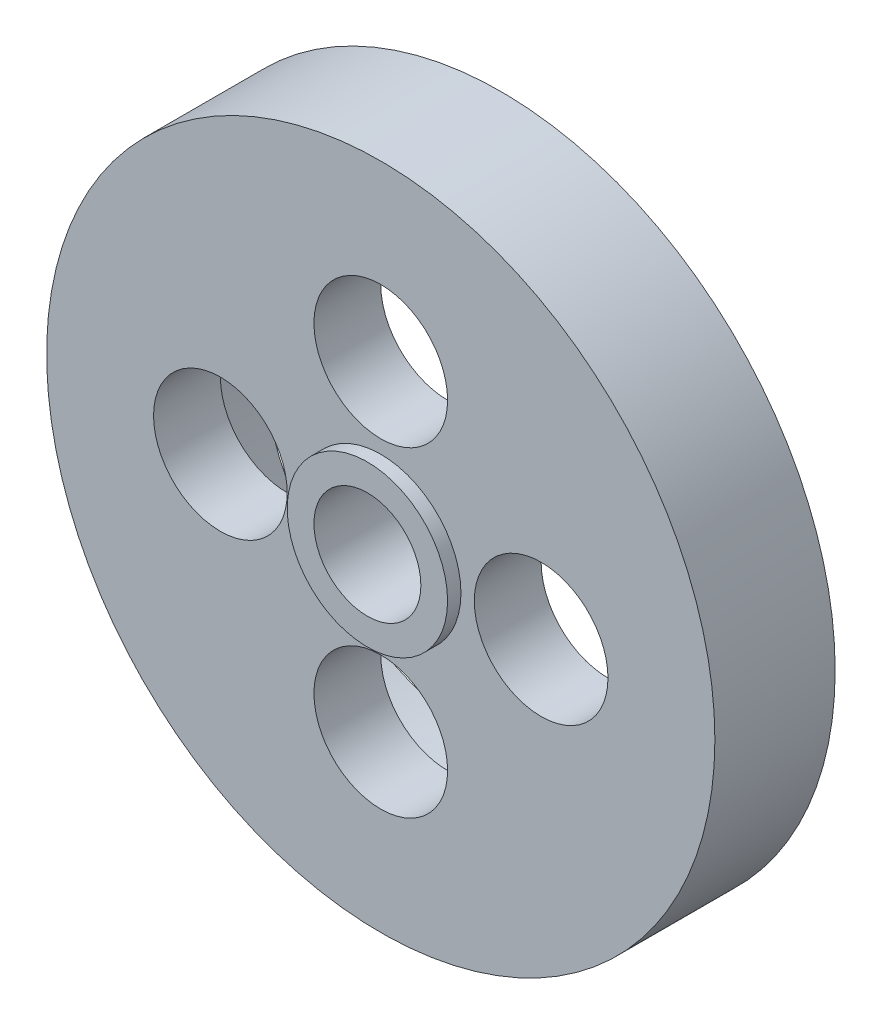
ISO-10303-21;
HEADER;
FILE_DESCRIPTION(('STEP AP214'),'2;1');
FILE_NAME('part.step','',(''),(''),'','','');
FILE_SCHEMA(('AUTOMOTIVE_DESIGN { 1 0 10303 214 1 1 1 1 }'));
ENDSEC;
DATA;
#1=APPLICATION_CONTEXT('core data for automotive mechanical design processes');
#2=APPLICATION_PROTOCOL_DEFINITION('international standard','automotive_design',2000,#1);
#3=PRODUCT_CONTEXT('',#1,'mechanical');
#4=PRODUCT('Part','Part','',(#3));
#5=PRODUCT_RELATED_PRODUCT_CATEGORY('part','',(#4));
#6=PRODUCT_DEFINITION_FORMATION('','',#4);
#7=PRODUCT_DEFINITION_CONTEXT('part definition',#1,'design');
#8=PRODUCT_DEFINITION('design','',#6,#7);
#9=PRODUCT_DEFINITION_SHAPE('','',#8);
#10=(LENGTH_UNIT() NAMED_UNIT(*) SI_UNIT(.MILLI.,.METRE.));
#11=(NAMED_UNIT(*) PLANE_ANGLE_UNIT() SI_UNIT($,.RADIAN.));
#12=(NAMED_UNIT(*) SI_UNIT($,.STERADIAN.) SOLID_ANGLE_UNIT());
#13=UNCERTAINTY_MEASURE_WITH_UNIT(LENGTH_MEASURE(1.E-05),#10,'distance_accuracy_value','');
#14=(GEOMETRIC_REPRESENTATION_CONTEXT(3) GLOBAL_UNCERTAINTY_ASSIGNED_CONTEXT((#13)) GLOBAL_UNIT_ASSIGNED_CONTEXT((#10,
#11,#12)) REPRESENTATION_CONTEXT('',''));
#15=CARTESIAN_POINT('',(0.,0.,0.));
#16=DIRECTION('',(0.,0.,1.));
#17=DIRECTION('',(1.,0.,0.));
#18=AXIS2_PLACEMENT_3D('',#15,#16,#17);
#19=CARTESIAN_POINT('',(0.,0.,9.));
#20=DIRECTION('',(0.,0.,1.));
#21=DIRECTION('',(1.,0.,0.));
#22=AXIS2_PLACEMENT_3D('',#19,#20,#21);
#23=PLANE('',#22);
#24=CARTESIAN_POINT('',(-11.9999999999997,-3.41060513164848E-13,9.));
#25=DIRECTION('',(0.,0.,1.));
#26=DIRECTION('',(1.,0.,0.));
#27=AXIS2_PLACEMENT_3D('',#24,#25,#26);
#28=CIRCLE('',#27,5.00000000000055);
#29=CARTESIAN_POINT('',(-6.99999999999912,-3.41060513164848E-13,9.));
#30=VERTEX_POINT('',#29);
#31=EDGE_CURVE('E58',#30,#30,#28,.T.);
#32=ORIENTED_EDGE('',*,*,#31,.F.);
#33=EDGE_LOOP('',(#32));
#34=FACE_BOUND('',#33,.T.);
#35=CARTESIAN_POINT('',(12.,0.,9.));
#36=DIRECTION('',(0.,0.,1.));
#37=DIRECTION('',(1.,0.,0.));
#38=AXIS2_PLACEMENT_3D('',#35,#36,#37);
#39=CIRCLE('',#38,5.);
#40=CARTESIAN_POINT('',(17.,0.,9.));
#41=VERTEX_POINT('',#40);
#42=EDGE_CURVE('E52',#41,#41,#39,.T.);
#43=ORIENTED_EDGE('',*,*,#42,.F.);
#44=EDGE_LOOP('',(#43));
#45=FACE_BOUND('',#44,.T.);
#46=CARTESIAN_POINT('',(0.,12.,9.));
#47=DIRECTION('',(0.,0.,1.));
#48=DIRECTION('',(1.,0.,0.));
#49=AXIS2_PLACEMENT_3D('',#46,#47,#48);
#50=CIRCLE('',#49,5.);
#51=CARTESIAN_POINT('',(5.,12.,9.));
#52=VERTEX_POINT('',#51);
#53=EDGE_CURVE('E48',#52,#52,#50,.T.);
#54=ORIENTED_EDGE('',*,*,#53,.F.);
#55=EDGE_LOOP('',(#54));
#56=FACE_BOUND('',#55,.T.);
#57=CARTESIAN_POINT('',(0.,0.,9.));
#58=DIRECTION('',(0.,0.,1.));
#59=DIRECTION('',(1.,0.,0.));
#60=AXIS2_PLACEMENT_3D('',#57,#58,#59);
#61=CIRCLE('',#60,25.);
#62=CARTESIAN_POINT('',(25.,0.,9.));
#63=VERTEX_POINT('',#62);
#64=EDGE_CURVE('E10',#63,#63,#61,.T.);
#65=ORIENTED_EDGE('',*,*,#64,.T.);
#66=EDGE_LOOP('',(#65));
#67=FACE_BOUND('',#66,.T.);
#68=CARTESIAN_POINT('',(0.,-12.,9.));
#69=DIRECTION('',(0.,0.,1.));
#70=DIRECTION('',(1.,0.,0.));
#71=AXIS2_PLACEMENT_3D('',#68,#69,#70);
#72=CIRCLE('',#71,5.00000000000008);
#73=CARTESIAN_POINT('',(5.00000000000008,-12.,9.));
#74=VERTEX_POINT('',#73);
#75=EDGE_CURVE('E55',#74,#74,#72,.T.);
#76=ORIENTED_EDGE('',*,*,#75,.F.);
#77=EDGE_LOOP('',(#76));
#78=FACE_BOUND('',#77,.T.);
#79=CARTESIAN_POINT('',(0.,0.,9.));
#80=DIRECTION('',(0.,0.,1.));
#81=DIRECTION('',(1.,0.,0.));
#82=AXIS2_PLACEMENT_3D('',#79,#80,#81);
#83=CIRCLE('',#82,6.);
#84=CARTESIAN_POINT('',(6.,0.,9.));
#85=VERTEX_POINT('',#84);
#86=EDGE_CURVE('E80',#85,#85,#83,.T.);
#87=ORIENTED_EDGE('',*,*,#86,.F.);
#88=EDGE_LOOP('',(#87));
#89=FACE_BOUND('',#88,.T.);
#90=ADVANCED_FACE('F35',(#34,#45,#56,#67,#78,#89),#23,.T.);
#91=CARTESIAN_POINT('',(0.,12.,9.));
#92=DIRECTION('',(0.,0.,-1.));
#93=DIRECTION('',(-1.,0.,0.));
#94=AXIS2_PLACEMENT_3D('',#91,#92,#93);
#95=CYLINDRICAL_SURFACE('',#94,5.);
#96=ORIENTED_EDGE('',*,*,#53,.T.);
#97=EDGE_LOOP('',(#96));
#98=FACE_BOUND('',#97,.T.);
#99=CARTESIAN_POINT('',(0.,12.,4.));
#100=DIRECTION('',(0.,0.,-1.));
#101=DIRECTION('',(-1.,0.,0.));
#102=AXIS2_PLACEMENT_3D('',#99,#100,#101);
#103=CIRCLE('',#102,5.);
#104=CARTESIAN_POINT('',(-5.,12.,4.));
#105=VERTEX_POINT('',#104);
#106=EDGE_CURVE('E61',#105,#105,#103,.T.);
#107=ORIENTED_EDGE('',*,*,#106,.T.);
#108=EDGE_LOOP('',(#107));
#109=FACE_BOUND('',#108,.T.);
#110=ADVANCED_FACE('F107',(#98,#109),#95,.F.);
#111=CARTESIAN_POINT('',(0.,0.,9.));
#112=DIRECTION('',(0.,0.,-1.));
#113=DIRECTION('',(-1.,0.,0.));
#114=AXIS2_PLACEMENT_3D('',#111,#112,#113);
#115=CYLINDRICAL_SURFACE('',#114,4.);
#116=CARTESIAN_POINT('',(0.,0.,4.));
#117=DIRECTION('',(0.,0.,-1.));
#118=DIRECTION('',(-1.,0.,0.));
#119=AXIS2_PLACEMENT_3D('',#116,#117,#118);
#120=CIRCLE('',#119,4.);
#121=CARTESIAN_POINT('',(-4.,0.,4.));
#122=VERTEX_POINT('',#121);
#123=EDGE_CURVE('E64',#122,#122,#120,.T.);
#124=ORIENTED_EDGE('',*,*,#123,.T.);
#125=EDGE_LOOP('',(#124));
#126=FACE_BOUND('',#125,.T.);
#127=CARTESIAN_POINT('',(0.,0.,10.));
#128=DIRECTION('',(0.,0.,1.));
#129=DIRECTION('',(1.,0.,0.));
#130=AXIS2_PLACEMENT_3D('',#127,#128,#129);
#131=CIRCLE('',#130,4.);
#132=CARTESIAN_POINT('',(4.,0.,10.));
#133=VERTEX_POINT('',#132);
#134=EDGE_CURVE('E83',#133,#133,#131,.T.);
#135=ORIENTED_EDGE('',*,*,#134,.T.);
#136=EDGE_LOOP('',(#135));
#137=FACE_BOUND('',#136,.T.);
#138=ADVANCED_FACE('F89',(#126,#137),#115,.F.);
#139=CARTESIAN_POINT('',(12.,0.,9.));
#140=DIRECTION('',(0.,0.,-1.));
#141=DIRECTION('',(-1.,0.,0.));
#142=AXIS2_PLACEMENT_3D('',#139,#140,#141);
#143=CYLINDRICAL_SURFACE('',#142,5.);
#144=ORIENTED_EDGE('',*,*,#42,.T.);
#145=EDGE_LOOP('',(#144));
#146=FACE_BOUND('',#145,.T.);
#147=CARTESIAN_POINT('',(12.,0.,4.));
#148=DIRECTION('',(0.,0.,-1.));
#149=DIRECTION('',(-1.,0.,0.));
#150=AXIS2_PLACEMENT_3D('',#147,#148,#149);
#151=CIRCLE('',#150,5.);
#152=CARTESIAN_POINT('',(7.,0.,4.));
#153=VERTEX_POINT('',#152);
#154=EDGE_CURVE('E67',#153,#153,#151,.T.);
#155=ORIENTED_EDGE('',*,*,#154,.T.);
#156=EDGE_LOOP('',(#155));
#157=FACE_BOUND('',#156,.T.);
#158=ADVANCED_FACE('F144',(#146,#157),#143,.F.);
#159=CARTESIAN_POINT('',(0.,-12.,9.));
#160=DIRECTION('',(0.,0.,-1.));
#161=DIRECTION('',(-1.,0.,0.));
#162=AXIS2_PLACEMENT_3D('',#159,#160,#161);
#163=CYLINDRICAL_SURFACE('',#162,5.00000000000008);
#164=ORIENTED_EDGE('',*,*,#75,.T.);
#165=EDGE_LOOP('',(#164));
#166=FACE_BOUND('',#165,.T.);
#167=CARTESIAN_POINT('',(0.,-12.,4.));
#168=DIRECTION('',(0.,0.,-1.));
#169=DIRECTION('',(-1.,0.,0.));
#170=AXIS2_PLACEMENT_3D('',#167,#168,#169);
#171=CIRCLE('',#170,5.00000000000008);
#172=CARTESIAN_POINT('',(-5.00000000000008,-12.,4.));
#173=VERTEX_POINT('',#172);
#174=EDGE_CURVE('E70',#173,#173,#171,.T.);
#175=ORIENTED_EDGE('',*,*,#174,.T.);
#176=EDGE_LOOP('',(#175));
#177=FACE_BOUND('',#176,.T.);
#178=ADVANCED_FACE('F127',(#166,#177),#163,.F.);
#179=CARTESIAN_POINT('',(-11.9999999999997,-3.41060513164848E-13,9.));
#180=DIRECTION('',(0.,0.,-1.));
#181=DIRECTION('',(-1.,0.,0.));
#182=AXIS2_PLACEMENT_3D('',#179,#180,#181);
#183=CYLINDRICAL_SURFACE('',#182,5.00000000000055);
#184=ORIENTED_EDGE('',*,*,#31,.T.);
#185=EDGE_LOOP('',(#184));
#186=FACE_BOUND('',#185,.T.);
#187=CARTESIAN_POINT('',(-11.9999999999997,-3.41060513164848E-13,4.));
#188=DIRECTION('',(0.,0.,-1.));
#189=DIRECTION('',(-1.,0.,0.));
#190=AXIS2_PLACEMENT_3D('',#187,#188,#189);
#191=CIRCLE('',#190,5.00000000000055);
#192=CARTESIAN_POINT('',(-17.0000000000002,-3.41060513164848E-13,4.));
#193=VERTEX_POINT('',#192);
#194=EDGE_CURVE('E39',#193,#193,#191,.T.);
#195=ORIENTED_EDGE('',*,*,#194,.T.);
#196=EDGE_LOOP('',(#195));
#197=FACE_BOUND('',#196,.T.);
#198=ADVANCED_FACE('F120',(#186,#197),#183,.F.);
#199=CARTESIAN_POINT('',(0.,0.,0.));
#200=DIRECTION('',(0.,0.,1.));
#201=DIRECTION('',(1.,0.,0.));
#202=AXIS2_PLACEMENT_3D('',#199,#200,#201);
#203=PLANE('',#202);
#204=CARTESIAN_POINT('',(0.,0.,0.));
#205=DIRECTION('',(0.,0.,-1.));
#206=DIRECTION('',(-1.,0.,0.));
#207=AXIS2_PLACEMENT_3D('',#204,#205,#206);
#208=CIRCLE('',#207,18.);
#209=CARTESIAN_POINT('',(-18.,0.,0.));
#210=VERTEX_POINT('',#209);
#211=EDGE_CURVE('E73',#210,#210,#208,.T.);
#212=ORIENTED_EDGE('',*,*,#211,.F.);
#213=EDGE_LOOP('',(#212));
#214=FACE_BOUND('',#213,.T.);
#215=CARTESIAN_POINT('',(0.,0.,0.));
#216=DIRECTION('',(0.,0.,1.));
#217=DIRECTION('',(1.,0.,0.));
#218=AXIS2_PLACEMENT_3D('',#215,#216,#217);
#219=CIRCLE('',#218,25.);
#220=CARTESIAN_POINT('',(25.,0.,0.));
#221=VERTEX_POINT('',#220);
#222=EDGE_CURVE('E43',#221,#221,#219,.T.);
#223=ORIENTED_EDGE('',*,*,#222,.F.);
#224=EDGE_LOOP('',(#223));
#225=FACE_BOUND('',#224,.T.);
#226=ADVANCED_FACE('F118',(#214,#225),#203,.F.);
#227=CARTESIAN_POINT('',(0.,0.,9.));
#228=DIRECTION('',(0.,0.,-1.));
#229=DIRECTION('',(-1.,0.,0.));
#230=AXIS2_PLACEMENT_3D('',#227,#228,#229);
#231=CYLINDRICAL_SURFACE('',#230,25.);
#232=ORIENTED_EDGE('',*,*,#64,.F.);
#233=EDGE_LOOP('',(#232));
#234=FACE_BOUND('',#233,.T.);
#235=ORIENTED_EDGE('',*,*,#222,.T.);
#236=EDGE_LOOP('',(#235));
#237=FACE_BOUND('',#236,.T.);
#238=ADVANCED_FACE('F37',(#234,#237),#231,.T.);
#239=CARTESIAN_POINT('',(0.,0.,4.));
#240=DIRECTION('',(0.,0.,-1.));
#241=DIRECTION('',(-1.,0.,0.));
#242=AXIS2_PLACEMENT_3D('',#239,#240,#241);
#243=CYLINDRICAL_SURFACE('',#242,18.);
#244=CARTESIAN_POINT('',(0.,0.,4.));
#245=DIRECTION('',(0.,0.,-1.));
#246=DIRECTION('',(-1.,0.,0.));
#247=AXIS2_PLACEMENT_3D('',#244,#245,#246);
#248=CIRCLE('',#247,18.);
#249=CARTESIAN_POINT('',(-18.,0.,4.));
#250=VERTEX_POINT('',#249);
#251=EDGE_CURVE('E76',#250,#250,#248,.T.);
#252=ORIENTED_EDGE('',*,*,#251,.F.);
#253=EDGE_LOOP('',(#252));
#254=FACE_BOUND('',#253,.T.);
#255=ORIENTED_EDGE('',*,*,#211,.T.);
#256=EDGE_LOOP('',(#255));
#257=FACE_BOUND('',#256,.T.);
#258=ADVANCED_FACE('F103',(#254,#257),#243,.F.);
#259=CARTESIAN_POINT('',(0.,0.,4.));
#260=DIRECTION('',(0.,0.,-1.));
#261=DIRECTION('',(-1.,0.,0.));
#262=AXIS2_PLACEMENT_3D('',#259,#260,#261);
#263=PLANE('',#262);
#264=ORIENTED_EDGE('',*,*,#106,.F.);
#265=EDGE_LOOP('',(#264));
#266=FACE_BOUND('',#265,.T.);
#267=ORIENTED_EDGE('',*,*,#123,.F.);
#268=EDGE_LOOP('',(#267));
#269=FACE_BOUND('',#268,.T.);
#270=ORIENTED_EDGE('',*,*,#154,.F.);
#271=EDGE_LOOP('',(#270));
#272=FACE_BOUND('',#271,.T.);
#273=ORIENTED_EDGE('',*,*,#174,.F.);
#274=EDGE_LOOP('',(#273));
#275=FACE_BOUND('',#274,.T.);
#276=ORIENTED_EDGE('',*,*,#194,.F.);
#277=EDGE_LOOP('',(#276));
#278=FACE_BOUND('',#277,.T.);
#279=ORIENTED_EDGE('',*,*,#251,.T.);
#280=EDGE_LOOP('',(#279));
#281=FACE_BOUND('',#280,.T.);
#282=ADVANCED_FACE('F94',(#266,#269,#272,#275,#278,#281),#263,.T.);
#283=CARTESIAN_POINT('',(0.,0.,10.));
#284=DIRECTION('',(0.,0.,1.));
#285=DIRECTION('',(1.,0.,0.));
#286=AXIS2_PLACEMENT_3D('',#283,#284,#285);
#287=PLANE('',#286);
#288=CARTESIAN_POINT('',(0.,0.,10.));
#289=DIRECTION('',(0.,0.,1.));
#290=DIRECTION('',(1.,0.,0.));
#291=AXIS2_PLACEMENT_3D('',#288,#289,#290);
#292=CIRCLE('',#291,6.);
#293=CARTESIAN_POINT('',(6.,0.,10.));
#294=VERTEX_POINT('',#293);
#295=EDGE_CURVE('E77',#294,#294,#292,.T.);
#296=ORIENTED_EDGE('',*,*,#295,.T.);
#297=EDGE_LOOP('',(#296));
#298=FACE_BOUND('',#297,.T.);
#299=ORIENTED_EDGE('',*,*,#134,.F.);
#300=EDGE_LOOP('',(#299));
#301=FACE_BOUND('',#300,.T.);
#302=ADVANCED_FACE('F91',(#298,#301),#287,.T.);
#303=CARTESIAN_POINT('',(0.,0.,10.));
#304=DIRECTION('',(0.,0.,-1.));
#305=DIRECTION('',(-1.,0.,0.));
#306=AXIS2_PLACEMENT_3D('',#303,#304,#305);
#307=CYLINDRICAL_SURFACE('',#306,6.);
#308=ORIENTED_EDGE('',*,*,#295,.F.);
#309=EDGE_LOOP('',(#308));
#310=FACE_BOUND('',#309,.T.);
#311=ORIENTED_EDGE('',*,*,#86,.T.);
#312=EDGE_LOOP('',(#311));
#313=FACE_BOUND('',#312,.T.);
#314=ADVANCED_FACE('F93',(#310,#313),#307,.T.);
#315=CLOSED_SHELL('',(#90,#110,#138,#158,#178,#198,#226,#238,#258,#282,#302,#314));
#316=MANIFOLD_SOLID_BREP('B2',#315);
#317=ADVANCED_BREP_SHAPE_REPRESENTATION('',(#18,#316),#14);
#318=SHAPE_DEFINITION_REPRESENTATION(#9,#317);
ENDSEC;
END-ISO-10303-21;
